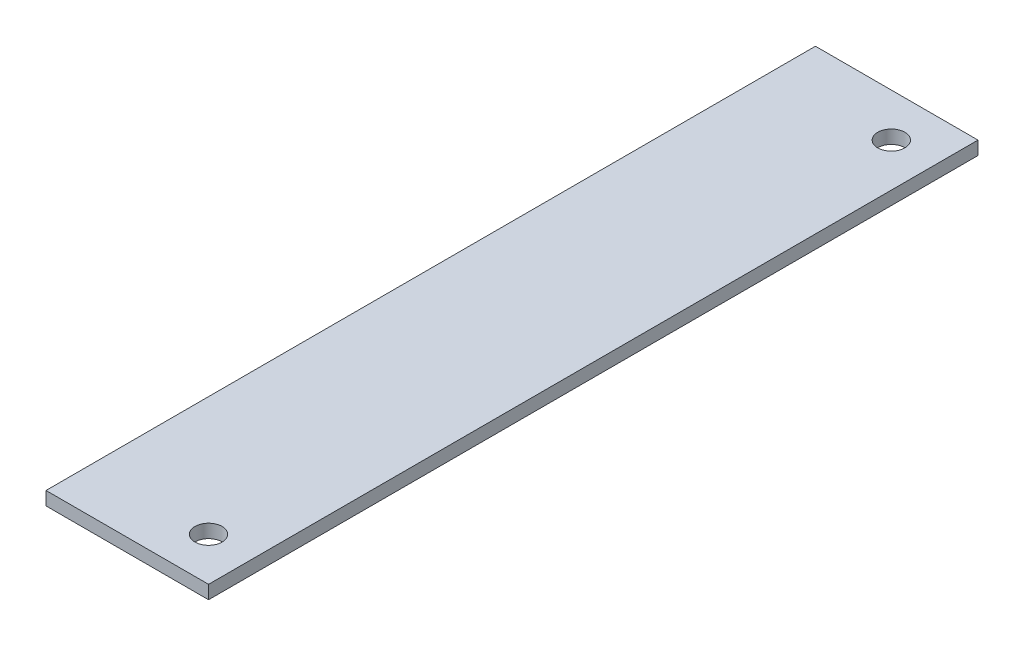
ISO-10303-21;
HEADER;
FILE_DESCRIPTION(('STEP AP214'),'2;1');
FILE_NAME('part.step','',(''),(''),'','','');
FILE_SCHEMA(('AUTOMOTIVE_DESIGN { 1 0 10303 214 1 1 1 1 }'));
ENDSEC;
DATA;
#1=APPLICATION_CONTEXT('core data for automotive mechanical design processes');
#2=APPLICATION_PROTOCOL_DEFINITION('international standard','automotive_design',2000,#1);
#3=PRODUCT_CONTEXT('',#1,'mechanical');
#4=PRODUCT('Part','Part','',(#3));
#5=PRODUCT_RELATED_PRODUCT_CATEGORY('part','',(#4));
#6=PRODUCT_DEFINITION_FORMATION('','',#4);
#7=PRODUCT_DEFINITION_CONTEXT('part definition',#1,'design');
#8=PRODUCT_DEFINITION('design','',#6,#7);
#9=PRODUCT_DEFINITION_SHAPE('','',#8);
#10=(LENGTH_UNIT() NAMED_UNIT(*) SI_UNIT(.MILLI.,.METRE.));
#11=(NAMED_UNIT(*) PLANE_ANGLE_UNIT() SI_UNIT($,.RADIAN.));
#12=(NAMED_UNIT(*) SI_UNIT($,.STERADIAN.) SOLID_ANGLE_UNIT());
#13=UNCERTAINTY_MEASURE_WITH_UNIT(LENGTH_MEASURE(1.E-05),#10,'distance_accuracy_value','');
#14=(GEOMETRIC_REPRESENTATION_CONTEXT(3) GLOBAL_UNCERTAINTY_ASSIGNED_CONTEXT((#13)) GLOBAL_UNIT_ASSIGNED_CONTEXT((#10,
#11,#12)) REPRESENTATION_CONTEXT('',''));
#15=CARTESIAN_POINT('',(0.,0.,0.));
#16=DIRECTION('',(0.,0.,1.));
#17=DIRECTION('',(1.,0.,0.));
#18=AXIS2_PLACEMENT_3D('',#15,#16,#17);
#19=CARTESIAN_POINT('',(9.525,1.57,45.085));
#20=DIRECTION('',(-1.,0.,0.));
#21=DIRECTION('',(0.,0.,1.));
#22=AXIS2_PLACEMENT_3D('',#19,#20,#21);
#23=PLANE('',#22);
#24=DIRECTION('',(0.,0.,-1.));
#25=VECTOR('',#24,1.);
#26=CARTESIAN_POINT('',(9.525,0.,45.085));
#27=LINE('',#26,#25);
#28=CARTESIAN_POINT('',(9.525,0.,45.085));
#29=VERTEX_POINT('',#28);
#30=CARTESIAN_POINT('',(9.525,0.,-45.085));
#31=VERTEX_POINT('',#30);
#32=EDGE_CURVE('E96',#29,#31,#27,.T.);
#33=ORIENTED_EDGE('',*,*,#32,.T.);
#34=DIRECTION('',(0.,-1.,0.));
#35=VECTOR('',#34,1.);
#36=CARTESIAN_POINT('',(9.525,1.57,-45.085));
#37=LINE('',#36,#35);
#38=CARTESIAN_POINT('',(9.525,1.57,-45.085));
#39=VERTEX_POINT('',#38);
#40=EDGE_CURVE('E11',#39,#31,#37,.T.);
#41=ORIENTED_EDGE('',*,*,#40,.F.);
#42=DIRECTION('',(0.,0.,-1.));
#43=VECTOR('',#42,1.);
#44=CARTESIAN_POINT('',(9.525,1.57,45.085));
#45=LINE('',#44,#43);
#46=CARTESIAN_POINT('',(9.525,1.57,45.085));
#47=VERTEX_POINT('',#46);
#48=EDGE_CURVE('E84',#47,#39,#45,.T.);
#49=ORIENTED_EDGE('',*,*,#48,.F.);
#50=DIRECTION('',(0.,-1.,0.));
#51=VECTOR('',#50,1.);
#52=CARTESIAN_POINT('',(9.525,1.57,45.085));
#53=LINE('',#52,#51);
#54=EDGE_CURVE('E92',#47,#29,#53,.T.);
#55=ORIENTED_EDGE('',*,*,#54,.T.);
#56=EDGE_LOOP('',(#33,#41,#49,#55));
#57=FACE_BOUND('',#56,.T.);
#58=ADVANCED_FACE('F33',(#57),#23,.F.);
#59=CARTESIAN_POINT('',(-9.525,1.57,-45.085));
#60=DIRECTION('',(0.,0.,1.));
#61=DIRECTION('',(1.,0.,0.));
#62=AXIS2_PLACEMENT_3D('',#59,#60,#61);
#63=PLANE('',#62);
#64=DIRECTION('',(-1.,0.,0.));
#65=VECTOR('',#64,1.);
#66=CARTESIAN_POINT('',(-9.525,0.,-45.085));
#67=LINE('',#66,#65);
#68=CARTESIAN_POINT('',(-9.525,0.,-45.085));
#69=VERTEX_POINT('',#68);
#70=EDGE_CURVE('E88',#31,#69,#67,.T.);
#71=ORIENTED_EDGE('',*,*,#70,.T.);
#72=DIRECTION('',(0.,-1.,0.));
#73=VECTOR('',#72,1.);
#74=CARTESIAN_POINT('',(-9.525,1.57,-45.085));
#75=LINE('',#74,#73);
#76=CARTESIAN_POINT('',(-9.525,1.57,-45.085));
#77=VERTEX_POINT('',#76);
#78=EDGE_CURVE('E41',#77,#69,#75,.T.);
#79=ORIENTED_EDGE('',*,*,#78,.F.);
#80=DIRECTION('',(-1.,0.,0.));
#81=VECTOR('',#80,1.);
#82=CARTESIAN_POINT('',(-9.525,1.57,-45.085));
#83=LINE('',#82,#81);
#84=EDGE_CURVE('E79',#39,#77,#83,.T.);
#85=ORIENTED_EDGE('',*,*,#84,.F.);
#86=ORIENTED_EDGE('',*,*,#40,.T.);
#87=EDGE_LOOP('',(#71,#79,#85,#86));
#88=FACE_BOUND('',#87,.T.);
#89=ADVANCED_FACE('F87',(#88),#63,.F.);
#90=CARTESIAN_POINT('',(-9.525,1.57,45.085));
#91=DIRECTION('',(1.,0.,0.));
#92=DIRECTION('',(0.,0.,-1.));
#93=AXIS2_PLACEMENT_3D('',#90,#91,#92);
#94=PLANE('',#93);
#95=DIRECTION('',(0.,0.,1.));
#96=VECTOR('',#95,1.);
#97=CARTESIAN_POINT('',(-9.525,0.,45.085));
#98=LINE('',#97,#96);
#99=CARTESIAN_POINT('',(-9.525,0.,45.085));
#100=VERTEX_POINT('',#99);
#101=EDGE_CURVE('E66',#69,#100,#98,.T.);
#102=ORIENTED_EDGE('',*,*,#101,.T.);
#103=DIRECTION('',(0.,-1.,0.));
#104=VECTOR('',#103,1.);
#105=CARTESIAN_POINT('',(-9.525,1.57,45.085));
#106=LINE('',#105,#104);
#107=CARTESIAN_POINT('',(-9.525,1.57,45.085));
#108=VERTEX_POINT('',#107);
#109=EDGE_CURVE('E89',#108,#100,#106,.T.);
#110=ORIENTED_EDGE('',*,*,#109,.F.);
#111=DIRECTION('',(0.,0.,1.));
#112=VECTOR('',#111,1.);
#113=CARTESIAN_POINT('',(-9.525,1.57,45.085));
#114=LINE('',#113,#112);
#115=EDGE_CURVE('E82',#77,#108,#114,.T.);
#116=ORIENTED_EDGE('',*,*,#115,.F.);
#117=ORIENTED_EDGE('',*,*,#78,.T.);
#118=EDGE_LOOP('',(#102,#110,#116,#117));
#119=FACE_BOUND('',#118,.T.);
#120=ADVANCED_FACE('F90',(#119),#94,.F.);
#121=CARTESIAN_POINT('',(-9.525,1.57,45.085));
#122=DIRECTION('',(0.,0.,-1.));
#123=DIRECTION('',(-1.,0.,0.));
#124=AXIS2_PLACEMENT_3D('',#121,#122,#123);
#125=PLANE('',#124);
#126=DIRECTION('',(1.,0.,0.));
#127=VECTOR('',#126,1.);
#128=CARTESIAN_POINT('',(-9.525,0.,45.085));
#129=LINE('',#128,#127);
#130=EDGE_CURVE('E72',#100,#29,#129,.T.);
#131=ORIENTED_EDGE('',*,*,#130,.T.);
#132=ORIENTED_EDGE('',*,*,#54,.F.);
#133=DIRECTION('',(1.,0.,0.));
#134=VECTOR('',#133,1.);
#135=CARTESIAN_POINT('',(-9.525,1.57,45.085));
#136=LINE('',#135,#134);
#137=EDGE_CURVE('E49',#108,#47,#136,.T.);
#138=ORIENTED_EDGE('',*,*,#137,.F.);
#139=ORIENTED_EDGE('',*,*,#109,.T.);
#140=EDGE_LOOP('',(#131,#132,#138,#139));
#141=FACE_BOUND('',#140,.T.);
#142=ADVANCED_FACE('F104',(#141),#125,.F.);
#143=CARTESIAN_POINT('',(0.,1.57,0.));
#144=DIRECTION('',(0.,-1.,0.));
#145=DIRECTION('',(0.,0.,-1.));
#146=AXIS2_PLACEMENT_3D('',#143,#144,#145);
#147=PLANE('',#146);
#148=CARTESIAN_POINT('',(4.445,1.57,-40.005));
#149=DIRECTION('',(0.,1.,0.));
#150=DIRECTION('',(0.,0.,1.));
#151=AXIS2_PLACEMENT_3D('',#148,#149,#150);
#152=CIRCLE('',#151,1.59);
#153=CARTESIAN_POINT('',(4.445,1.57,-38.415));
#154=VERTEX_POINT('',#153);
#155=EDGE_CURVE('E116',#154,#154,#152,.T.);
#156=ORIENTED_EDGE('',*,*,#155,.F.);
#157=EDGE_LOOP('',(#156));
#158=FACE_BOUND('',#157,.T.);
#159=CARTESIAN_POINT('',(4.445,1.57,40.005));
#160=DIRECTION('',(0.,1.,0.));
#161=DIRECTION('',(0.,0.,1.));
#162=AXIS2_PLACEMENT_3D('',#159,#160,#161);
#163=CIRCLE('',#162,1.59);
#164=CARTESIAN_POINT('',(4.445,1.57,41.595));
#165=VERTEX_POINT('',#164);
#166=EDGE_CURVE('E110',#165,#165,#163,.T.);
#167=ORIENTED_EDGE('',*,*,#166,.F.);
#168=EDGE_LOOP('',(#167));
#169=FACE_BOUND('',#168,.T.);
#170=ORIENTED_EDGE('',*,*,#48,.T.);
#171=ORIENTED_EDGE('',*,*,#84,.T.);
#172=ORIENTED_EDGE('',*,*,#115,.T.);
#173=ORIENTED_EDGE('',*,*,#137,.T.);
#174=EDGE_LOOP('',(#170,#171,#172,#173));
#175=FACE_BOUND('',#174,.T.);
#176=ADVANCED_FACE('F80',(#158,#169,#175),#147,.F.);
#177=CARTESIAN_POINT('',(0.,0.,0.));
#178=DIRECTION('',(0.,-1.,0.));
#179=DIRECTION('',(0.,0.,-1.));
#180=AXIS2_PLACEMENT_3D('',#177,#178,#179);
#181=PLANE('',#180);
#182=CARTESIAN_POINT('',(4.445,0.,-40.005));
#183=DIRECTION('',(0.,1.,0.));
#184=DIRECTION('',(0.,0.,1.));
#185=AXIS2_PLACEMENT_3D('',#182,#183,#184);
#186=CIRCLE('',#185,1.59);
#187=CARTESIAN_POINT('',(4.445,0.,-38.415));
#188=VERTEX_POINT('',#187);
#189=EDGE_CURVE('E113',#188,#188,#186,.T.);
#190=ORIENTED_EDGE('',*,*,#189,.T.);
#191=EDGE_LOOP('',(#190));
#192=FACE_BOUND('',#191,.T.);
#193=CARTESIAN_POINT('',(4.445,0.,40.005));
#194=DIRECTION('',(0.,1.,0.));
#195=DIRECTION('',(0.,0.,1.));
#196=AXIS2_PLACEMENT_3D('',#193,#194,#195);
#197=CIRCLE('',#196,1.59);
#198=CARTESIAN_POINT('',(4.445,0.,41.595));
#199=VERTEX_POINT('',#198);
#200=EDGE_CURVE('E99',#199,#199,#197,.T.);
#201=ORIENTED_EDGE('',*,*,#200,.T.);
#202=EDGE_LOOP('',(#201));
#203=FACE_BOUND('',#202,.T.);
#204=ORIENTED_EDGE('',*,*,#32,.F.);
#205=ORIENTED_EDGE('',*,*,#130,.F.);
#206=ORIENTED_EDGE('',*,*,#101,.F.);
#207=ORIENTED_EDGE('',*,*,#70,.F.);
#208=EDGE_LOOP('',(#204,#205,#206,#207));
#209=FACE_BOUND('',#208,.T.);
#210=ADVANCED_FACE('F107',(#192,#203,#209),#181,.T.);
#211=CARTESIAN_POINT('',(4.445,0.,40.005));
#212=DIRECTION('',(0.,1.,0.));
#213=DIRECTION('',(0.,0.,1.));
#214=AXIS2_PLACEMENT_3D('',#211,#212,#213);
#215=CYLINDRICAL_SURFACE('',#214,1.59);
#216=ORIENTED_EDGE('',*,*,#200,.F.);
#217=EDGE_LOOP('',(#216));
#218=FACE_BOUND('',#217,.T.);
#219=ORIENTED_EDGE('',*,*,#166,.T.);
#220=EDGE_LOOP('',(#219));
#221=FACE_BOUND('',#220,.T.);
#222=ADVANCED_FACE('F127',(#218,#221),#215,.F.);
#223=CARTESIAN_POINT('',(4.445,0.,-40.005));
#224=DIRECTION('',(0.,1.,0.));
#225=DIRECTION('',(0.,0.,1.));
#226=AXIS2_PLACEMENT_3D('',#223,#224,#225);
#227=CYLINDRICAL_SURFACE('',#226,1.59);
#228=ORIENTED_EDGE('',*,*,#189,.F.);
#229=EDGE_LOOP('',(#228));
#230=FACE_BOUND('',#229,.T.);
#231=ORIENTED_EDGE('',*,*,#155,.T.);
#232=EDGE_LOOP('',(#231));
#233=FACE_BOUND('',#232,.T.);
#234=ADVANCED_FACE('F124',(#230,#233),#227,.F.);
#235=CLOSED_SHELL('',(#58,#89,#120,#142,#176,#210,#222,#234));
#236=MANIFOLD_SOLID_BREP('B2',#235);
#237=ADVANCED_BREP_SHAPE_REPRESENTATION('',(#18,#236),#14);
#238=SHAPE_DEFINITION_REPRESENTATION(#9,#237);
ENDSEC;
END-ISO-10303-21;
